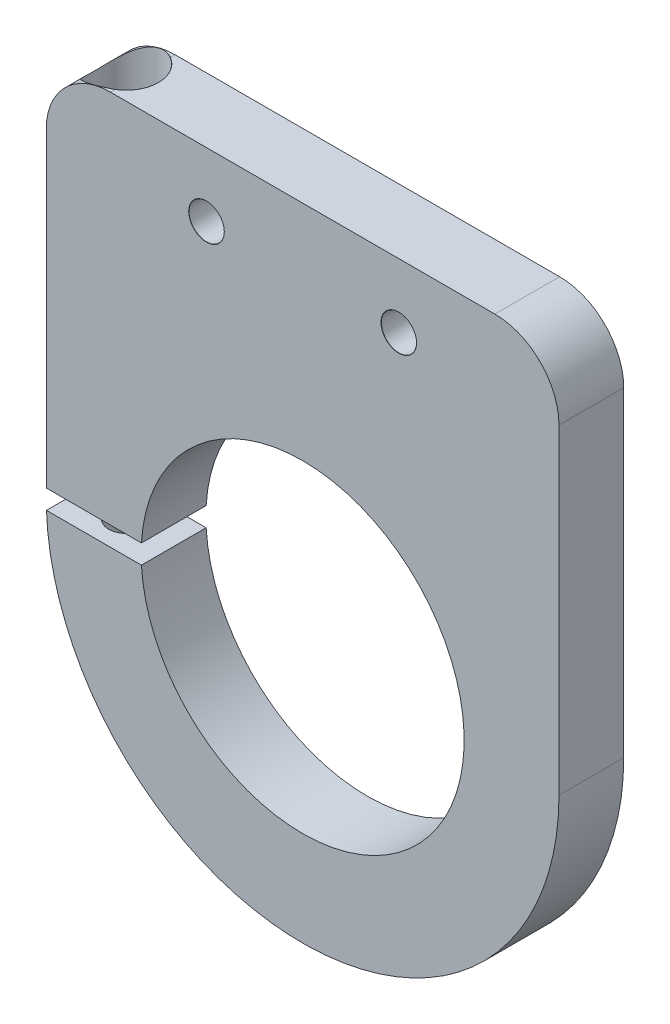
ISO-10303-21;
HEADER;
FILE_DESCRIPTION(('STEP AP214'),'2;1');
FILE_NAME('part.step','',(''),(''),'','','');
FILE_SCHEMA(('AUTOMOTIVE_DESIGN { 1 0 10303 214 1 1 1 1 }'));
ENDSEC;
DATA;
#1=APPLICATION_CONTEXT('core data for automotive mechanical design processes');
#2=APPLICATION_PROTOCOL_DEFINITION('international standard','automotive_design',2000,#1);
#3=PRODUCT_CONTEXT('',#1,'mechanical');
#4=PRODUCT('Part','Part','',(#3));
#5=PRODUCT_RELATED_PRODUCT_CATEGORY('part','',(#4));
#6=PRODUCT_DEFINITION_FORMATION('','',#4);
#7=PRODUCT_DEFINITION_CONTEXT('part definition',#1,'design');
#8=PRODUCT_DEFINITION('design','',#6,#7);
#9=PRODUCT_DEFINITION_SHAPE('','',#8);
#10=(LENGTH_UNIT() NAMED_UNIT(*) SI_UNIT(.MILLI.,.METRE.));
#11=(NAMED_UNIT(*) PLANE_ANGLE_UNIT() SI_UNIT($,.RADIAN.));
#12=(NAMED_UNIT(*) SI_UNIT($,.STERADIAN.) SOLID_ANGLE_UNIT());
#13=UNCERTAINTY_MEASURE_WITH_UNIT(LENGTH_MEASURE(1.E-05),#10,'distance_accuracy_value','');
#14=(GEOMETRIC_REPRESENTATION_CONTEXT(3) GLOBAL_UNCERTAINTY_ASSIGNED_CONTEXT((#13)) GLOBAL_UNIT_ASSIGNED_CONTEXT((#10,
#11,#12)) REPRESENTATION_CONTEXT('',''));
#15=CARTESIAN_POINT('',(0.,0.,0.));
#16=DIRECTION('',(0.,0.,1.));
#17=DIRECTION('',(1.,0.,0.));
#18=AXIS2_PLACEMENT_3D('',#15,#16,#17);
#19=CARTESIAN_POINT('',(-40.,0.,10.1));
#20=DIRECTION('',(-1.,0.,0.));
#21=DIRECTION('',(0.,0.,1.));
#22=AXIS2_PLACEMENT_3D('',#19,#20,#21);
#23=PLANE('',#22);
#24=DIRECTION('',(0.,1.,0.));
#25=VECTOR('',#24,1.);
#26=CARTESIAN_POINT('',(-40.,0.,10.1));
#27=LINE('',#26,#25);
#28=CARTESIAN_POINT('',(-40.,1.5,10.1));
#29=VERTEX_POINT('',#28);
#30=CARTESIAN_POINT('',(-40.,50.,10.1));
#31=VERTEX_POINT('',#30);
#32=EDGE_CURVE('E262',#29,#31,#27,.T.);
#33=ORIENTED_EDGE('',*,*,#32,.T.);
#34=DIRECTION('',(0.,0.,-1.));
#35=VECTOR('',#34,1.);
#36=CARTESIAN_POINT('',(-40.,50.,10.1));
#37=LINE('',#36,#35);
#38=CARTESIAN_POINT('',(-40.,50.,0.));
#39=VERTEX_POINT('',#38);
#40=EDGE_CURVE('E292',#31,#39,#37,.T.);
#41=ORIENTED_EDGE('',*,*,#40,.T.);
#42=DIRECTION('',(0.,1.,0.));
#43=VECTOR('',#42,1.);
#44=CARTESIAN_POINT('',(-40.,0.,0.));
#45=LINE('',#44,#43);
#46=CARTESIAN_POINT('',(-40.,1.5,0.));
#47=VERTEX_POINT('',#46);
#48=EDGE_CURVE('E277',#47,#39,#45,.T.);
#49=ORIENTED_EDGE('',*,*,#48,.F.);
#50=DIRECTION('',(0.,0.,1.));
#51=VECTOR('',#50,1.);
#52=CARTESIAN_POINT('',(-40.,1.5,0.));
#53=LINE('',#52,#51);
#54=EDGE_CURVE('E248',#47,#29,#53,.T.);
#55=ORIENTED_EDGE('',*,*,#54,.T.);
#56=EDGE_LOOP('',(#33,#41,#49,#55));
#57=FACE_BOUND('',#56,.T.);
#58=ADVANCED_FACE('F41',(#57),#23,.T.);
#59=CARTESIAN_POINT('',(0.,0.,10.1));
#60=DIRECTION('',(0.,0.,-1.));
#61=DIRECTION('',(-1.,0.,0.));
#62=AXIS2_PLACEMENT_3D('',#59,#60,#61);
#63=CYLINDRICAL_SURFACE('',#62,40.);
#64=CARTESIAN_POINT('',(0.,0.,53.251794638514));
#65=DIRECTION('',(0.866025403784438,0.,-0.5));
#66=DIRECTION('',(-0.5,0.,-0.866025403784439));
#67=AXIS2_PLACEMENT_3D('',#64,#65,#66);
#68=ELLIPSE('',#67,80.,40.);
#69=CARTESIAN_POINT('',(-27.8293191099691,-28.7320204280087,5.05));
#70=VERTEX_POINT('',#69);
#71=CARTESIAN_POINT('',(-30.1964552136466,-26.233072495044,0.95));
#72=VERTEX_POINT('',#71);
#73=EDGE_CURVE('E49',#70,#72,#68,.T.);
#74=ORIENTED_EDGE('',*,*,#73,.T.);
#75=CARTESIAN_POINT('',(0.,0.,0.949999999999996));
#76=DIRECTION('',(0.,0.,-1.));
#77=DIRECTION('',(-1.,0.,0.));
#78=AXIS2_PLACEMENT_3D('',#75,#76,#77);
#79=CIRCLE('',#78,40.);
#80=CARTESIAN_POINT('',(-34.9307274210015,-19.4895941938177,0.950000000000002));
#81=VERTEX_POINT('',#80);
#82=EDGE_CURVE('E11',#72,#81,#79,.T.);
#83=ORIENTED_EDGE('',*,*,#82,.T.);
#84=CARTESIAN_POINT('',(0.,0.,-59.5517946385141));
#85=DIRECTION('',(-0.866025403784439,0.,-0.5));
#86=DIRECTION('',(0.5,0.,-0.866025403784439));
#87=AXIS2_PLACEMENT_3D('',#84,#85,#86);
#88=ELLIPSE('',#87,80.0000000000001,40.);
#89=CARTESIAN_POINT('',(-36.4383040220041,-16.5,3.56119926923845));
#90=VERTEX_POINT('',#89);
#91=EDGE_CURVE('E349',#81,#90,#88,.T.);
#92=ORIENTED_EDGE('',*,*,#91,.T.);
#93=DIRECTION('',(0.,0.,-1.));
#94=VECTOR('',#93,1.);
#95=CARTESIAN_POINT('',(-36.4383040220041,-16.5,10.1));
#96=LINE('',#95,#94);
#97=CARTESIAN_POINT('',(-36.4383040220041,-16.5,6.53880073076155));
#98=VERTEX_POINT('',#97);
#99=EDGE_CURVE('E201',#90,#98,#96,.F.);
#100=ORIENTED_EDGE('',*,*,#99,.T.);
#101=CARTESIAN_POINT('',(0.,0.,69.651794638514));
#102=DIRECTION('',(-0.866025403784439,0.,0.5));
#103=DIRECTION('',(-0.5,0.,-0.866025403784439));
#104=AXIS2_PLACEMENT_3D('',#101,#102,#103);
#105=ELLIPSE('',#104,80.,40.);
#106=CARTESIAN_POINT('',(-34.9307274210015,-19.4895941938177,9.14999999999999));
#107=VERTEX_POINT('',#106);
#108=EDGE_CURVE('E354',#98,#107,#105,.T.);
#109=ORIENTED_EDGE('',*,*,#108,.T.);
#110=CARTESIAN_POINT('',(0.,0.,9.14999999999999));
#111=DIRECTION('',(0.,0.,1.));
#112=DIRECTION('',(1.,0.,0.));
#113=AXIS2_PLACEMENT_3D('',#110,#111,#112);
#114=CIRCLE('',#113,40.);
#115=CARTESIAN_POINT('',(-30.1964552136466,-26.233072495044,9.14999999999999));
#116=VERTEX_POINT('',#115);
#117=EDGE_CURVE('E357',#107,#116,#114,.T.);
#118=ORIENTED_EDGE('',*,*,#117,.T.);
#119=CARTESIAN_POINT('',(0.,0.,-43.1517946385141));
#120=DIRECTION('',(0.866025403784439,0.,0.499999999999999));
#121=DIRECTION('',(0.5,0.,-0.866025403784439));
#122=AXIS2_PLACEMENT_3D('',#119,#120,#121);
#123=ELLIPSE('',#122,80.0000000000001,40.);
#124=EDGE_CURVE('E360',#116,#70,#123,.T.);
#125=ORIENTED_EDGE('',*,*,#124,.T.);
#126=EDGE_LOOP('',(#74,#83,#92,#100,#109,#118,#125));
#127=FACE_BOUND('',#126,.T.);
#128=CARTESIAN_POINT('',(0.,0.,10.1));
#129=DIRECTION('',(0.,0.,1.));
#130=DIRECTION('',(1.,0.,0.));
#131=AXIS2_PLACEMENT_3D('',#128,#129,#130);
#132=CIRCLE('',#131,40.);
#133=CARTESIAN_POINT('',(-39.9718651053463,-1.5,10.1));
#134=VERTEX_POINT('',#133);
#135=CARTESIAN_POINT('',(40.,0.,10.1));
#136=VERTEX_POINT('',#135);
#137=EDGE_CURVE('E266',#134,#136,#132,.T.);
#138=ORIENTED_EDGE('',*,*,#137,.F.);
#139=DIRECTION('',(0.,0.,-1.));
#140=VECTOR('',#139,1.);
#141=CARTESIAN_POINT('',(-39.9718651053463,-1.5,10.1));
#142=LINE('',#141,#140);
#143=CARTESIAN_POINT('',(-39.9718651053463,-1.5,0.));
#144=VERTEX_POINT('',#143);
#145=EDGE_CURVE('E251',#134,#144,#142,.T.);
#146=ORIENTED_EDGE('',*,*,#145,.T.);
#147=CARTESIAN_POINT('',(0.,0.,0.));
#148=DIRECTION('',(0.,0.,1.));
#149=DIRECTION('',(1.,0.,0.));
#150=AXIS2_PLACEMENT_3D('',#147,#148,#149);
#151=CIRCLE('',#150,40.);
#152=CARTESIAN_POINT('',(40.,0.,0.));
#153=VERTEX_POINT('',#152);
#154=EDGE_CURVE('E280',#144,#153,#151,.T.);
#155=ORIENTED_EDGE('',*,*,#154,.T.);
#156=DIRECTION('',(0.,0.,-1.));
#157=VECTOR('',#156,1.);
#158=CARTESIAN_POINT('',(40.,0.,10.1));
#159=LINE('',#158,#157);
#160=EDGE_CURVE('E274',#136,#153,#159,.T.);
#161=ORIENTED_EDGE('',*,*,#160,.F.);
#162=EDGE_LOOP('',(#138,#146,#155,#161));
#163=FACE_BOUND('',#162,.T.);
#164=ADVANCED_FACE('F362',(#127,#163),#63,.T.);
#165=CARTESIAN_POINT('',(40.,0.,10.1));
#166=DIRECTION('',(1.,0.,0.));
#167=DIRECTION('',(0.,0.,-1.));
#168=AXIS2_PLACEMENT_3D('',#165,#166,#167);
#169=PLANE('',#168);
#170=DIRECTION('',(0.,-1.,0.));
#171=VECTOR('',#170,1.);
#172=CARTESIAN_POINT('',(40.,0.,0.));
#173=LINE('',#172,#171);
#174=CARTESIAN_POINT('',(40.,50.,0.));
#175=VERTEX_POINT('',#174);
#176=EDGE_CURVE('E283',#175,#153,#173,.T.);
#177=ORIENTED_EDGE('',*,*,#176,.F.);
#178=DIRECTION('',(0.,0.,-1.));
#179=VECTOR('',#178,1.);
#180=CARTESIAN_POINT('',(40.,50.,10.1));
#181=LINE('',#180,#179);
#182=CARTESIAN_POINT('',(40.,50.,10.1));
#183=VERTEX_POINT('',#182);
#184=EDGE_CURVE('E64',#175,#183,#181,.F.);
#185=ORIENTED_EDGE('',*,*,#184,.T.);
#186=DIRECTION('',(0.,-1.,0.));
#187=VECTOR('',#186,1.);
#188=CARTESIAN_POINT('',(40.,0.,10.1));
#189=LINE('',#188,#187);
#190=EDGE_CURVE('E269',#183,#136,#189,.T.);
#191=ORIENTED_EDGE('',*,*,#190,.T.);
#192=ORIENTED_EDGE('',*,*,#160,.T.);
#193=EDGE_LOOP('',(#177,#185,#191,#192));
#194=FACE_BOUND('',#193,.T.);
#195=ADVANCED_FACE('F390',(#194),#169,.T.);
#196=CARTESIAN_POINT('',(0.,0.,10.1));
#197=DIRECTION('',(0.,0.,-1.));
#198=DIRECTION('',(-1.,0.,0.));
#199=AXIS2_PLACEMENT_3D('',#196,#197,#198);
#200=CYLINDRICAL_SURFACE('',#199,25.2);
#201=DIRECTION('',(0.,0.,1.));
#202=VECTOR('',#201,1.);
#203=CARTESIAN_POINT('',(-25.1553175293018,1.5,0.));
#204=LINE('',#203,#202);
#205=CARTESIAN_POINT('',(-25.1553175293018,1.5,0.));
#206=VERTEX_POINT('',#205);
#207=CARTESIAN_POINT('',(-25.1553175293018,1.5,10.1));
#208=VERTEX_POINT('',#207);
#209=EDGE_CURVE('E252',#206,#208,#204,.T.);
#210=ORIENTED_EDGE('',*,*,#209,.F.);
#211=CARTESIAN_POINT('',(0.,0.,0.));
#212=DIRECTION('',(0.,0.,1.));
#213=DIRECTION('',(1.,0.,0.));
#214=AXIS2_PLACEMENT_3D('',#211,#212,#213);
#215=CIRCLE('',#214,25.2);
#216=CARTESIAN_POINT('',(-25.1553175293018,-1.5,0.));
#217=VERTEX_POINT('',#216);
#218=EDGE_CURVE('E258',#217,#206,#215,.T.);
#219=ORIENTED_EDGE('',*,*,#218,.F.);
#220=DIRECTION('',(0.,0.,1.));
#221=VECTOR('',#220,1.);
#222=CARTESIAN_POINT('',(-25.1553175293018,-1.5,0.));
#223=LINE('',#222,#221);
#224=CARTESIAN_POINT('',(-25.1553175293018,-1.5,10.1));
#225=VERTEX_POINT('',#224);
#226=EDGE_CURVE('E244',#217,#225,#223,.T.);
#227=ORIENTED_EDGE('',*,*,#226,.T.);
#228=CARTESIAN_POINT('',(0.,0.,10.1));
#229=DIRECTION('',(0.,0.,1.));
#230=DIRECTION('',(1.,0.,0.));
#231=AXIS2_PLACEMENT_3D('',#228,#229,#230);
#232=CIRCLE('',#231,25.2);
#233=EDGE_CURVE('E259',#225,#208,#232,.T.);
#234=ORIENTED_EDGE('',*,*,#233,.T.);
#235=EDGE_LOOP('',(#210,#219,#227,#234));
#236=FACE_BOUND('',#235,.T.);
#237=ADVANCED_FACE('F393',(#236),#200,.F.);
#238=CARTESIAN_POINT('',(0.,60.,10.1));
#239=DIRECTION('',(0.,1.,0.));
#240=DIRECTION('',(0.,0.,1.));
#241=AXIS2_PLACEMENT_3D('',#238,#239,#240);
#242=PLANE('',#241);
#243=DIRECTION('',(1.,0.,0.));
#244=VECTOR('',#243,1.);
#245=CARTESIAN_POINT('',(0.,60.,0.));
#246=LINE('',#245,#244);
#247=CARTESIAN_POINT('',(-30.,60.,0.));
#248=VERTEX_POINT('',#247);
#249=CARTESIAN_POINT('',(30.,60.,0.));
#250=VERTEX_POINT('',#249);
#251=EDGE_CURVE('E263',#248,#250,#246,.T.);
#252=ORIENTED_EDGE('',*,*,#251,.F.);
#253=DIRECTION('',(0.,0.,-1.));
#254=VECTOR('',#253,1.);
#255=CARTESIAN_POINT('',(-30.,60.,10.1));
#256=LINE('',#255,#254);
#257=CARTESIAN_POINT('',(-30.,60.,0.728122565627212));
#258=VERTEX_POINT('',#257);
#259=EDGE_CURVE('E304',#248,#258,#256,.F.);
#260=ORIENTED_EDGE('',*,*,#259,.T.);
#261=CARTESIAN_POINT('',(-32.5635913173241,60.,5.05));
#262=DIRECTION('',(0.,1.,0.));
#263=DIRECTION('',(0.,0.,1.));
#264=AXIS2_PLACEMENT_3D('',#261,#262,#263);
#265=CIRCLE('',#264,5.025);
#266=CARTESIAN_POINT('',(-30.,60.,9.37187743437279));
#267=VERTEX_POINT('',#266);
#268=EDGE_CURVE('E222',#267,#258,#265,.T.);
#269=ORIENTED_EDGE('',*,*,#268,.F.);
#270=DIRECTION('',(0.,0.,-1.));
#271=VECTOR('',#270,1.);
#272=CARTESIAN_POINT('',(-30.,60.,10.1));
#273=LINE('',#272,#271);
#274=CARTESIAN_POINT('',(-30.,60.,10.1));
#275=VERTEX_POINT('',#274);
#276=EDGE_CURVE('E302',#267,#275,#273,.F.);
#277=ORIENTED_EDGE('',*,*,#276,.T.);
#278=DIRECTION('',(1.,0.,0.));
#279=VECTOR('',#278,1.);
#280=CARTESIAN_POINT('',(0.,60.,10.1));
#281=LINE('',#280,#279);
#282=CARTESIAN_POINT('',(30.,60.,10.1));
#283=VERTEX_POINT('',#282);
#284=EDGE_CURVE('E271',#275,#283,#281,.T.);
#285=ORIENTED_EDGE('',*,*,#284,.T.);
#286=DIRECTION('',(0.,0.,-1.));
#287=VECTOR('',#286,1.);
#288=CARTESIAN_POINT('',(30.,60.,10.1));
#289=LINE('',#288,#287);
#290=EDGE_CURVE('E299',#283,#250,#289,.T.);
#291=ORIENTED_EDGE('',*,*,#290,.T.);
#292=EDGE_LOOP('',(#252,#260,#269,#277,#285,#291));
#293=FACE_BOUND('',#292,.T.);
#294=ADVANCED_FACE('F395',(#293),#242,.T.);
#295=CARTESIAN_POINT('',(0.,0.,10.1));
#296=DIRECTION('',(0.,0.,1.));
#297=DIRECTION('',(1.,0.,0.));
#298=AXIS2_PLACEMENT_3D('',#295,#296,#297);
#299=PLANE('',#298);
#300=CARTESIAN_POINT('',(-15.,50.,10.1));
#301=DIRECTION('',(0.,0.,1.));
#302=DIRECTION('',(1.,0.,0.));
#303=AXIS2_PLACEMENT_3D('',#300,#301,#302);
#304=CIRCLE('',#303,2.775);
#305=CARTESIAN_POINT('',(-12.225,50.,10.1));
#306=VERTEX_POINT('',#305);
#307=EDGE_CURVE('E204',#306,#306,#304,.T.);
#308=ORIENTED_EDGE('',*,*,#307,.F.);
#309=EDGE_LOOP('',(#308));
#310=FACE_BOUND('',#309,.T.);
#311=CARTESIAN_POINT('',(15.,50.,10.1));
#312=DIRECTION('',(0.,0.,1.));
#313=DIRECTION('',(1.,0.,0.));
#314=AXIS2_PLACEMENT_3D('',#311,#312,#313);
#315=CIRCLE('',#314,2.775);
#316=CARTESIAN_POINT('',(17.775,50.,10.1));
#317=VERTEX_POINT('',#316);
#318=EDGE_CURVE('E213',#317,#317,#315,.T.);
#319=ORIENTED_EDGE('',*,*,#318,.F.);
#320=EDGE_LOOP('',(#319));
#321=FACE_BOUND('',#320,.T.);
#322=ORIENTED_EDGE('',*,*,#284,.F.);
#323=CARTESIAN_POINT('',(-30.,50.,10.1));
#324=DIRECTION('',(0.,0.,1.));
#325=DIRECTION('',(1.,0.,0.));
#326=AXIS2_PLACEMENT_3D('',#323,#324,#325);
#327=CIRCLE('',#326,10.);
#328=EDGE_CURVE('E346',#275,#31,#327,.T.);
#329=ORIENTED_EDGE('',*,*,#328,.T.);
#330=ORIENTED_EDGE('',*,*,#32,.F.);
#331=DIRECTION('',(-1.,0.,0.));
#332=VECTOR('',#331,1.);
#333=CARTESIAN_POINT('',(-40.,1.5,10.1));
#334=LINE('',#333,#332);
#335=EDGE_CURVE('E245',#208,#29,#334,.T.);
#336=ORIENTED_EDGE('',*,*,#335,.F.);
#337=ORIENTED_EDGE('',*,*,#233,.F.);
#338=DIRECTION('',(1.,0.,0.));
#339=VECTOR('',#338,1.);
#340=CARTESIAN_POINT('',(-40.,-1.5,10.1));
#341=LINE('',#340,#339);
#342=EDGE_CURVE('E240',#134,#225,#341,.T.);
#343=ORIENTED_EDGE('',*,*,#342,.F.);
#344=ORIENTED_EDGE('',*,*,#137,.T.);
#345=ORIENTED_EDGE('',*,*,#190,.F.);
#346=CARTESIAN_POINT('',(30.,50.,10.1));
#347=DIRECTION('',(0.,0.,1.));
#348=DIRECTION('',(1.,0.,0.));
#349=AXIS2_PLACEMENT_3D('',#346,#347,#348);
#350=CIRCLE('',#349,10.);
#351=EDGE_CURVE('E344',#183,#283,#350,.T.);
#352=ORIENTED_EDGE('',*,*,#351,.T.);
#353=EDGE_LOOP('',(#322,#329,#330,#336,#337,#343,#344,#345,#352));
#354=FACE_BOUND('',#353,.T.);
#355=ADVANCED_FACE('F401',(#310,#321,#354),#299,.T.);
#356=CARTESIAN_POINT('',(0.,0.,0.));
#357=DIRECTION('',(0.,0.,1.));
#358=DIRECTION('',(1.,0.,0.));
#359=AXIS2_PLACEMENT_3D('',#356,#357,#358);
#360=PLANE('',#359);
#361=CARTESIAN_POINT('',(-15.,50.,0.));
#362=DIRECTION('',(0.,0.,1.));
#363=DIRECTION('',(1.,0.,0.));
#364=AXIS2_PLACEMENT_3D('',#361,#362,#363);
#365=CIRCLE('',#364,2.75);
#366=CARTESIAN_POINT('',(-12.25,50.,0.));
#367=VERTEX_POINT('',#366);
#368=EDGE_CURVE('E210',#367,#367,#365,.T.);
#369=ORIENTED_EDGE('',*,*,#368,.T.);
#370=EDGE_LOOP('',(#369));
#371=FACE_BOUND('',#370,.T.);
#372=CARTESIAN_POINT('',(15.,50.,0.));
#373=DIRECTION('',(0.,0.,1.));
#374=DIRECTION('',(1.,0.,0.));
#375=AXIS2_PLACEMENT_3D('',#372,#373,#374);
#376=CIRCLE('',#375,2.75);
#377=CARTESIAN_POINT('',(17.75,50.,0.));
#378=VERTEX_POINT('',#377);
#379=EDGE_CURVE('E219',#378,#378,#376,.T.);
#380=ORIENTED_EDGE('',*,*,#379,.T.);
#381=EDGE_LOOP('',(#380));
#382=FACE_BOUND('',#381,.T.);
#383=ORIENTED_EDGE('',*,*,#48,.T.);
#384=CARTESIAN_POINT('',(-30.,50.,0.));
#385=DIRECTION('',(0.,0.,1.));
#386=DIRECTION('',(1.,0.,0.));
#387=AXIS2_PLACEMENT_3D('',#384,#385,#386);
#388=CIRCLE('',#387,10.);
#389=EDGE_CURVE('E297',#39,#248,#388,.F.);
#390=ORIENTED_EDGE('',*,*,#389,.T.);
#391=ORIENTED_EDGE('',*,*,#251,.T.);
#392=CARTESIAN_POINT('',(30.,50.,0.));
#393=DIRECTION('',(0.,0.,1.));
#394=DIRECTION('',(1.,0.,0.));
#395=AXIS2_PLACEMENT_3D('',#392,#393,#394);
#396=CIRCLE('',#395,10.);
#397=EDGE_CURVE('E295',#250,#175,#396,.F.);
#398=ORIENTED_EDGE('',*,*,#397,.T.);
#399=ORIENTED_EDGE('',*,*,#176,.T.);
#400=ORIENTED_EDGE('',*,*,#154,.F.);
#401=DIRECTION('',(1.,0.,0.));
#402=VECTOR('',#401,1.);
#403=CARTESIAN_POINT('',(0.,-1.5,0.));
#404=LINE('',#403,#402);
#405=EDGE_CURVE('E289',#144,#217,#404,.T.);
#406=ORIENTED_EDGE('',*,*,#405,.T.);
#407=ORIENTED_EDGE('',*,*,#218,.T.);
#408=DIRECTION('',(-1.,0.,0.));
#409=VECTOR('',#408,1.);
#410=CARTESIAN_POINT('',(-40.,1.5,0.));
#411=LINE('',#410,#409);
#412=EDGE_CURVE('E241',#206,#47,#411,.T.);
#413=ORIENTED_EDGE('',*,*,#412,.T.);
#414=EDGE_LOOP('',(#383,#390,#391,#398,#399,#400,#406,#407,#413));
#415=FACE_BOUND('',#414,.T.);
#416=ADVANCED_FACE('F410',(#371,#382,#415),#360,.F.);
#417=CARTESIAN_POINT('',(-40.,-1.5,0.));
#418=DIRECTION('',(0.,-1.,0.));
#419=DIRECTION('',(1.,0.,0.));
#420=AXIS2_PLACEMENT_3D('',#417,#418,#419);
#421=PLANE('',#420);
#422=CARTESIAN_POINT('',(-32.5635913173241,-1.5,5.05));
#423=DIRECTION('',(0.,-1.,0.));
#424=DIRECTION('',(1.,0.,0.));
#425=AXIS2_PLACEMENT_3D('',#422,#423,#424);
#426=CIRCLE('',#425,2.74999999999999);
#427=CARTESIAN_POINT('',(-29.8135913173241,-1.5,5.05));
#428=VERTEX_POINT('',#427);
#429=EDGE_CURVE('E237',#428,#428,#426,.T.);
#430=ORIENTED_EDGE('',*,*,#429,.T.);
#431=EDGE_LOOP('',(#430));
#432=FACE_BOUND('',#431,.T.);
#433=ORIENTED_EDGE('',*,*,#342,.T.);
#434=ORIENTED_EDGE('',*,*,#226,.F.);
#435=ORIENTED_EDGE('',*,*,#405,.F.);
#436=ORIENTED_EDGE('',*,*,#145,.F.);
#437=EDGE_LOOP('',(#433,#434,#435,#436));
#438=FACE_BOUND('',#437,.T.);
#439=ADVANCED_FACE('F414',(#432,#438),#421,.F.);
#440=CARTESIAN_POINT('',(-40.,1.5,0.));
#441=DIRECTION('',(0.,1.,0.));
#442=DIRECTION('',(-1.,0.,0.));
#443=AXIS2_PLACEMENT_3D('',#440,#441,#442);
#444=PLANE('',#443);
#445=CARTESIAN_POINT('',(-32.5635913173241,1.5,5.05));
#446=DIRECTION('',(0.,1.,0.));
#447=DIRECTION('',(-1.,0.,0.));
#448=AXIS2_PLACEMENT_3D('',#445,#446,#447);
#449=CIRCLE('',#448,2.74999999999999);
#450=CARTESIAN_POINT('',(-35.313591317324,1.5,5.05));
#451=VERTEX_POINT('',#450);
#452=EDGE_CURVE('E234',#451,#451,#449,.T.);
#453=ORIENTED_EDGE('',*,*,#452,.T.);
#454=EDGE_LOOP('',(#453));
#455=FACE_BOUND('',#454,.T.);
#456=ORIENTED_EDGE('',*,*,#335,.T.);
#457=ORIENTED_EDGE('',*,*,#54,.F.);
#458=ORIENTED_EDGE('',*,*,#412,.F.);
#459=ORIENTED_EDGE('',*,*,#209,.T.);
#460=EDGE_LOOP('',(#456,#457,#458,#459));
#461=FACE_BOUND('',#460,.T.);
#462=ADVANCED_FACE('F422',(#455,#461),#444,.F.);
#463=CARTESIAN_POINT('',(-32.5635913173241,60.,5.05));
#464=DIRECTION('',(0.,1.,0.));
#465=DIRECTION('',(0.,0.,1.));
#466=AXIS2_PLACEMENT_3D('',#463,#464,#465);
#467=CYLINDRICAL_SURFACE('',#466,2.74999999999999);
#468=CARTESIAN_POINT('',(-32.5635913173241,-16.5,5.05));
#469=DIRECTION('',(0.,1.,0.));
#470=DIRECTION('',(0.,0.,1.));
#471=AXIS2_PLACEMENT_3D('',#468,#469,#470);
#472=CIRCLE('',#471,2.74999999999999);
#473=CARTESIAN_POINT('',(-32.5635913173241,-16.5,7.79999999999999));
#474=VERTEX_POINT('',#473);
#475=EDGE_CURVE('E195',#474,#474,#472,.F.);
#476=ORIENTED_EDGE('',*,*,#475,.T.);
#477=EDGE_LOOP('',(#476));
#478=FACE_BOUND('',#477,.T.);
#479=ORIENTED_EDGE('',*,*,#429,.F.);
#480=EDGE_LOOP('',(#479));
#481=FACE_BOUND('',#480,.T.);
#482=ADVANCED_FACE('F480',(#478,#481),#467,.F.);
#483=CARTESIAN_POINT('',(-32.5635913173241,50.,5.05));
#484=DIRECTION('',(0.,1.,0.));
#485=DIRECTION('',(0.,0.,1.));
#486=AXIS2_PLACEMENT_3D('',#483,#484,#485);
#487=CIRCLE('',#486,2.75);
#488=CARTESIAN_POINT('',(-32.5635913173241,50.,7.8));
#489=VERTEX_POINT('',#488);
#490=EDGE_CURVE('E231',#489,#489,#487,.T.);
#491=ORIENTED_EDGE('',*,*,#490,.T.);
#492=EDGE_LOOP('',(#491));
#493=FACE_BOUND('',#492,.T.);
#494=ORIENTED_EDGE('',*,*,#452,.F.);
#495=EDGE_LOOP('',(#494));
#496=FACE_BOUND('',#495,.T.);
#497=ADVANCED_FACE('F483',(#493,#496),#467,.F.);
#498=CARTESIAN_POINT('',(-27.5635913173241,50.,5.05));
#499=DIRECTION('',(0.,-1.,0.));
#500=DIRECTION('',(0.,0.,-1.));
#501=AXIS2_PLACEMENT_3D('',#498,#499,#500);
#502=PLANE('',#501);
#503=ORIENTED_EDGE('',*,*,#490,.F.);
#504=EDGE_LOOP('',(#503));
#505=FACE_BOUND('',#504,.T.);
#506=CARTESIAN_POINT('',(-32.5635913173241,50.,5.05));
#507=DIRECTION('',(0.,1.,0.));
#508=DIRECTION('',(0.,0.,1.));
#509=AXIS2_PLACEMENT_3D('',#506,#507,#508);
#510=CIRCLE('',#509,5.);
#511=CARTESIAN_POINT('',(-32.5635913173241,50.,10.05));
#512=VERTEX_POINT('',#511);
#513=EDGE_CURVE('E228',#512,#512,#510,.T.);
#514=ORIENTED_EDGE('',*,*,#513,.T.);
#515=EDGE_LOOP('',(#514));
#516=FACE_BOUND('',#515,.T.);
#517=ADVANCED_FACE('F335',(#505,#516),#502,.F.);
#518=CARTESIAN_POINT('',(-32.5635913173241,60.,5.05));
#519=DIRECTION('',(0.,1.,0.));
#520=DIRECTION('',(0.,0.,1.));
#521=AXIS2_PLACEMENT_3D('',#518,#519,#520);
#522=CYLINDRICAL_SURFACE('',#521,5.);
#523=ORIENTED_EDGE('',*,*,#513,.F.);
#524=EDGE_LOOP('',(#523));
#525=FACE_BOUND('',#524,.T.);
#526=CARTESIAN_POINT('',(-32.5635913173241,59.975,5.05));
#527=DIRECTION('',(0.,1.,0.));
#528=DIRECTION('',(0.,0.,1.));
#529=AXIS2_PLACEMENT_3D('',#526,#527,#528);
#530=CIRCLE('',#529,4.99999999999999);
#531=CARTESIAN_POINT('',(-30.7066647012552,59.975,9.69239416061743));
#532=VERTEX_POINT('',#531);
#533=CARTESIAN_POINT('',(-30.7066647012552,59.975,0.407605839382568));
#534=VERTEX_POINT('',#533);
#535=EDGE_CURVE('E225',#532,#534,#530,.T.);
#536=ORIENTED_EDGE('',*,*,#535,.T.);
#537=CARTESIAN_POINT('',(-30.7066647012563,59.9749999999999,0.407605839382118));
#538=CARTESIAN_POINT('',(-30.827860355132,59.966435416529,0.35910346129362));
#539=CARTESIAN_POINT('',(-30.9508262926674,59.9554838115774,0.315447707163212));
#540=CARTESIAN_POINT('',(-31.1992661123685,59.9286078876016,0.237985695919973));
#541=CARTESIAN_POINT('',(-31.3247395311649,59.912684479531,0.204177636664663));
#542=CARTESIAN_POINT('',(-31.5766643127462,59.8757428401059,0.146673224169126));
#543=CARTESIAN_POINT('',(-31.7031091552752,59.8547467984339,0.12293403913425));
#544=CARTESIAN_POINT('',(-31.9564981459066,59.8075845587991,0.0853410030436932));
#545=CARTESIAN_POINT('',(-32.0834422897745,59.7814184045905,0.0714870683345971));
#546=CARTESIAN_POINT('',(-32.3368072484082,59.724001201804,0.0535319493025308));
#547=CARTESIAN_POINT('',(-32.4632282628026,59.6927523207922,0.049426619206704));
#548=CARTESIAN_POINT('',(-32.7147458855301,59.6253372256584,0.0507023702890224));
#549=CARTESIAN_POINT('',(-32.8398419737263,59.5891691522602,0.0560870475919438));
#550=CARTESIAN_POINT('',(-33.0878963288026,59.5121899253903,0.0760089289009665));
#551=CARTESIAN_POINT('',(-33.2108539559444,59.4713774091306,0.0905488249645308));
#552=CARTESIAN_POINT('',(-33.4539149993666,59.3854742581538,0.128366805304438));
#553=CARTESIAN_POINT('',(-33.5740172885529,59.3403819680154,0.151648281210943));
#554=CARTESIAN_POINT('',(-33.9399660263189,59.1949665198824,0.236468588418862));
#555=CARTESIAN_POINT('',(-34.1800969235703,59.0880421879661,0.312039574768618));
#556=CARTESIAN_POINT('',(-34.6410676951857,58.8615275800542,0.495248379959157));
#557=CARTESIAN_POINT('',(-34.8619041566549,58.7419350714931,0.60289185714858));
#558=CARTESIAN_POINT('',(-35.315084110913,58.4752174300899,0.865717222662063));
#559=CARTESIAN_POINT('',(-35.5438279054197,58.3267111181512,1.02570045949824));
#560=CARTESIAN_POINT('',(-35.9710492119663,58.0258912765112,1.38031747200683));
#561=CARTESIAN_POINT('',(-36.1694492934071,57.8735691242394,1.57503723537818));
#562=CARTESIAN_POINT('',(-36.455080804175,57.6387246527472,1.90649903701136));
#563=CARTESIAN_POINT('',(-36.5535337558954,57.5542464134585,2.03235832298599));
#564=CARTESIAN_POINT('',(-36.7390641478581,57.3892083732819,2.29477466842778));
#565=CARTESIAN_POINT('',(-36.8261368755394,57.3086502043113,2.43133612246404));
#566=CARTESIAN_POINT('',(-36.9876838869885,57.1543493476537,2.71464344539185));
#567=CARTESIAN_POINT('',(-37.062200256085,57.0805842843429,2.8613528704779));
#568=CARTESIAN_POINT('',(-37.1976751560414,56.9428230494723,3.16508325788571));
#569=CARTESIAN_POINT('',(-37.2586482795262,56.8788163869549,3.32209288320989));
#570=CARTESIAN_POINT('',(-37.3715156057641,56.7578398130708,3.66443766915315));
#571=CARTESIAN_POINT('',(-37.4216138122869,56.7024743726605,3.85097139834873));
#572=CARTESIAN_POINT('',(-37.4806377557049,56.6363334087587,4.13774829852906));
#573=CARTESIAN_POINT('',(-37.4976219968519,56.6171081240032,4.23446766189423));
#574=CARTESIAN_POINT('',(-37.5259483738968,56.5848740498758,4.42973646415167));
#575=CARTESIAN_POINT('',(-37.5372930239706,56.571862490476,4.52828506719087));
#576=CARTESIAN_POINT('',(-37.5541669541866,56.5524598065121,4.72721655654906));
#577=CARTESIAN_POINT('',(-37.5596559002571,56.5461146042802,4.82760738083948));
#578=CARTESIAN_POINT('',(-37.5645578778696,56.5404494062543,5.02873647551352));
#579=CARTESIAN_POINT('',(-37.5639709858804,56.5411293220442,5.12947474150838));
#580=CARTESIAN_POINT('',(-37.5567317023924,56.5494913742097,5.330465443682));
#581=CARTESIAN_POINT('',(-37.5500778609833,56.5571751844114,5.43071775796768));
#582=CARTESIAN_POINT('',(-37.5308561436651,56.5792409766138,5.62992456797942));
#583=CARTESIAN_POINT('',(-37.5182858394772,56.593625708832,5.72887851366293));
#584=CARTESIAN_POINT('',(-37.4743437597331,56.643499665012,6.00819668274945));
#585=CARTESIAN_POINT('',(-37.4360749551119,56.6865319000886,6.18619206243009));
#586=CARTESIAN_POINT('',(-37.3421841475894,56.7894859775998,6.53234248882127));
#587=CARTESIAN_POINT('',(-37.2865483673496,56.8494212256513,6.70048959661351));
#588=CARTESIAN_POINT('',(-37.1721436782308,56.968919034688,6.99451392032689));
#589=CARTESIAN_POINT('',(-37.1160173363591,57.0263528948418,7.1223174190473));
#590=CARTESIAN_POINT('',(-36.9946323825294,57.1471986894131,7.3705539823409));
#591=CARTESIAN_POINT('',(-36.9293719389272,57.2106118220083,7.49098556165774));
#592=CARTESIAN_POINT('',(-36.7902683607541,57.3417580910482,7.7246445406187));
#593=CARTESIAN_POINT('',(-36.7164093102852,57.4094991304046,7.83785796056111));
#594=CARTESIAN_POINT('',(-36.5607124945411,57.5477077138456,8.05683715850867));
#595=CARTESIAN_POINT('',(-36.4788758063017,57.6181748891106,8.16260393854977));
#596=CARTESIAN_POINT('',(-36.3048585995081,57.762857140168,8.3699097435488));
#597=CARTESIAN_POINT('',(-36.212433098226,57.8371203061362,8.47120990160141));
#598=CARTESIAN_POINT('',(-36.0197623330062,57.986071374604,8.6657491839414));
#599=CARTESIAN_POINT('',(-35.9195142941564,58.0607594190317,8.75898542273569));
#600=CARTESIAN_POINT('',(-35.6073362540849,58.2838976556186,9.02625780091381));
#601=CARTESIAN_POINT('',(-35.3838670902006,58.4315115638541,9.18798285411144));
#602=CARTESIAN_POINT('',(-35.0086052907639,58.6567821263267,9.41438302025866));
#603=CARTESIAN_POINT('',(-34.866032203893,58.7378265364459,9.49132293811288));
#604=CARTESIAN_POINT('',(-34.5718800688724,58.8952620163805,9.63184778957352));
#605=CARTESIAN_POINT('',(-34.420299426755,58.9716522577261,9.6954303503932));
#606=CARTESIAN_POINT('',(-34.1092759084239,59.1182992243707,9.80795861128659));
#607=CARTESIAN_POINT('',(-33.9498461022291,59.188565639951,9.85692774457408));
#608=CARTESIAN_POINT('',(-33.6240713440829,59.3218577629078,9.9391275764273));
#609=CARTESIAN_POINT('',(-33.4577294154999,59.3848865915417,9.97236507881579));
#610=CARTESIAN_POINT('',(-33.1651028258469,59.4867954284619,10.0152599054767));
#611=CARTESIAN_POINT('',(-33.0400566869657,59.5276151240967,10.0288525662243));
#612=CARTESIAN_POINT('',(-32.7878415835199,59.6044417897517,10.0465671042298));
#613=CARTESIAN_POINT('',(-32.6606730644745,59.6404497558807,10.050690944562));
#614=CARTESIAN_POINT('',(-32.4051189653142,59.707360226469,10.0491206135022));
#615=CARTESIAN_POINT('',(-32.27673398595,59.7382651249707,10.0434310603666));
#616=CARTESIAN_POINT('',(-32.0196949181623,59.794801676646,10.0220016068011));
#617=CARTESIAN_POINT('',(-31.8910409717795,59.8204356272586,10.0062660974142));
#618=CARTESIAN_POINT('',(-31.6343407042641,59.8664047501151,9.96461196356324));
#619=CARTESIAN_POINT('',(-31.5062948591574,59.8867362845136,9.93868637837579));
#620=CARTESIAN_POINT('',(-31.251943963736,59.922153603557,9.87666771797359));
#621=CARTESIAN_POINT('',(-31.1256389985272,59.9372391326089,9.84057414751504));
#622=CARTESIAN_POINT('',(-30.8753379613286,59.9624113982528,9.75820673297558));
#623=CARTESIAN_POINT('',(-30.7513527429685,59.9724785222597,9.71189395182955));
#624=CARTESIAN_POINT('',(-30.5071884806191,59.9878840498512,9.60947328061493));
#625=CARTESIAN_POINT('',(-30.387009517169,59.9932223534398,9.55336518344402));
#626=CARTESIAN_POINT('',(-30.2692319192881,59.9963750516693,9.49251223438314));
#627=B_SPLINE_CURVE_WITH_KNOTS('',3,(#537,#538,#539,#540,#541,#542,#543,#544,#545,#546,#547,
#548,#549,#550,#551,#552,#553,#554,#555,#556,#557,#558,#559,#560,#561,#562,#563,#564,#565,#566,
#567,#568,#569,#570,#571,#572,#573,#574,#575,#576,#577,#578,#579,#580,#581,#582,#583,#584,#585,
#586,#587,#588,#589,#590,#591,#592,#593,#594,#595,#596,#597,#598,#599,#600,#601,#602,#603,#604,
#605,#606,#607,#608,#609,#610,#611,#612,#613,#614,#615,#616,#617,#618,#619,#620,#621,#622,#623,
#624,#625,#626),.UNSPECIFIED.,.F.,.F.,(4,2,2,2,2,2,2,2,2,2,2,2,2,2,2,2,2,2,2,2,2,2,2,2,2,2,2,2,
2,2,2,2,2,2,2,2,2,2,2,2,2,2,2,2,4),(0.,0.392342022700355,0.784612201066487,1.17519655351071,
1.56577760061601,1.95619251619925,2.34675540665534,2.73743319431795,3.12826271726111,
3.94533512031608,4.76255175977784,5.70754595919987,6.65491272941827,7.19656545083954,
7.73844176523206,8.27846409117939,8.81790169849444,9.41809526026173,9.71797870579153,
10.0177283406562,10.3195295771145,10.6213270151962,10.9231965972707,11.2251901830937,
11.7841332504649,12.3435208628721,12.7957334939006,13.24803693654,13.7011913116013,
14.1542845922268,14.6216813064782,15.08924458215,16.0238163574193,16.5666445922017,
17.1095691730304,17.6516184158644,18.1934330114067,18.5897491154862,18.9859830479555,
19.3820305606452,19.777905081129,20.1740504902146,20.5702151973691,20.9679162621111,
21.365625736463),.UNSPECIFIED.);
#628=EDGE_CURVE('E338',#534,#532,#627,.T.);
#629=ORIENTED_EDGE('',*,*,#628,.T.);
#630=EDGE_LOOP('',(#536,#629));
#631=FACE_BOUND('',#630,.T.);
#632=ADVANCED_FACE('F328',(#525,#631),#522,.F.);
#633=CARTESIAN_POINT('',(-32.5635913173241,60.,5.05));
#634=DIRECTION('',(0.,1.,0.));
#635=DIRECTION('',(0.,0.,1.));
#636=AXIS2_PLACEMENT_3D('',#633,#634,#635);
#637=CONICAL_SURFACE('',#636,5.025,0.785398163397518);
#638=ORIENTED_EDGE('',*,*,#268,.T.);
#639=CARTESIAN_POINT('',(-30.,60.,0.728122565627212));
#640=CARTESIAN_POINT('',(-30.0788364018077,60.0000050014083,0.68134349097746));
#641=CARTESIAN_POINT('',(-30.15946170707,59.9990675697666,0.637536433436425));
#642=CARTESIAN_POINT('',(-30.3232537969961,59.9951062420872,0.556602950160756));
#643=CARTESIAN_POINT('',(-30.4063992421382,59.9920967670245,0.519432572362842));
#644=CARTESIAN_POINT('',(-30.5753073639118,59.9837950062374,0.451847126039772));
#645=CARTESIAN_POINT('',(-30.6610704298698,59.9785023793803,0.421433068025907));
#646=CARTESIAN_POINT('',(-30.8352126094172,59.9654475333822,0.367519527784197));
#647=CARTESIAN_POINT('',(-30.923605744931,59.9576684348683,0.344069483216149));
#648=CARTESIAN_POINT('',(-31.0127180441463,59.9485879481995,0.324392190520006));
#649=B_SPLINE_CURVE_WITH_KNOTS('',3,(#639,#640,#641,#642,#643,#644,#645,#646,#647,#648),
.UNSPECIFIED.,.F.,.F.,(4,2,2,2,4),(0.,0.274973418658145,0.548052174392227,0.821171745786518,
1.09618623292706),.UNSPECIFIED.);
#650=EDGE_CURVE('E313',#258,#534,#649,.T.);
#651=ORIENTED_EDGE('',*,*,#650,.T.);
#652=ORIENTED_EDGE('',*,*,#535,.F.);
#653=CARTESIAN_POINT('',(-30.7066647012552,59.975,9.69239416061743));
#654=CARTESIAN_POINT('',(-30.6118635876635,59.9817254537022,9.66173174493452));
#655=CARTESIAN_POINT('',(-30.5183776560108,59.9869808575484,9.6267919919315));
#656=CARTESIAN_POINT('',(-30.3353519044135,59.9947895104791,9.5492212627474));
#657=CARTESIAN_POINT('',(-30.2457879095719,59.9973625630464,9.50664941313245));
#658=CARTESIAN_POINT('',(-30.0705088488402,60.0001361894604,9.41421269131845));
#659=CARTESIAN_POINT('',(-29.9847931030153,60.0003371840749,9.36434911415228));
#660=CARTESIAN_POINT('',(-29.8169911934805,59.9986805696884,9.2575574347057));
#661=CARTESIAN_POINT('',(-29.7349370351798,59.996807525781,9.20057920211365));
#662=CARTESIAN_POINT('',(-29.6552595154549,59.9940559333193,9.14054135684072));
#663=B_SPLINE_CURVE_WITH_KNOTS('',3,(#653,#654,#655,#656,#657,#658,#659,#660,#661,#662),
.UNSPECIFIED.,.F.,.F.,(4,2,2,2,4),(0.,0.299431181601102,0.596635695620824,0.893787489183162,
1.19316562560422),.UNSPECIFIED.);
#664=EDGE_CURVE('E306',#532,#267,#663,.T.);
#665=ORIENTED_EDGE('',*,*,#664,.T.);
#666=EDGE_LOOP('',(#638,#651,#652,#665));
#667=FACE_BOUND('',#666,.T.);
#668=ADVANCED_FACE('F322',(#667),#637,.F.);
#669=CARTESIAN_POINT('',(15.,50.,10.1));
#670=DIRECTION('',(0.,0.,1.));
#671=DIRECTION('',(1.,0.,0.));
#672=AXIS2_PLACEMENT_3D('',#669,#670,#671);
#673=CYLINDRICAL_SURFACE('',#672,2.75);
#674=ORIENTED_EDGE('',*,*,#379,.F.);
#675=EDGE_LOOP('',(#674));
#676=FACE_BOUND('',#675,.T.);
#677=CARTESIAN_POINT('',(15.,50.,10.075));
#678=DIRECTION('',(0.,0.,1.));
#679=DIRECTION('',(1.,0.,0.));
#680=AXIS2_PLACEMENT_3D('',#677,#678,#679);
#681=CIRCLE('',#680,2.75);
#682=CARTESIAN_POINT('',(17.75,50.,10.075));
#683=VERTEX_POINT('',#682);
#684=EDGE_CURVE('E216',#683,#683,#681,.T.);
#685=ORIENTED_EDGE('',*,*,#684,.T.);
#686=EDGE_LOOP('',(#685));
#687=FACE_BOUND('',#686,.T.);
#688=ADVANCED_FACE('F327',(#676,#687),#673,.F.);
#689=CARTESIAN_POINT('',(15.,50.,10.1));
#690=DIRECTION('',(0.,0.,1.));
#691=DIRECTION('',(1.,0.,0.));
#692=AXIS2_PLACEMENT_3D('',#689,#690,#691);
#693=CONICAL_SURFACE('',#692,2.775,0.785398163397414);
#694=ORIENTED_EDGE('',*,*,#684,.F.);
#695=EDGE_LOOP('',(#694));
#696=FACE_BOUND('',#695,.T.);
#697=ORIENTED_EDGE('',*,*,#318,.T.);
#698=EDGE_LOOP('',(#697));
#699=FACE_BOUND('',#698,.T.);
#700=ADVANCED_FACE('F452',(#696,#699),#693,.F.);
#701=CARTESIAN_POINT('',(-15.,50.,10.1));
#702=DIRECTION('',(0.,0.,1.));
#703=DIRECTION('',(1.,0.,0.));
#704=AXIS2_PLACEMENT_3D('',#701,#702,#703);
#705=CYLINDRICAL_SURFACE('',#704,2.75);
#706=ORIENTED_EDGE('',*,*,#368,.F.);
#707=EDGE_LOOP('',(#706));
#708=FACE_BOUND('',#707,.T.);
#709=CARTESIAN_POINT('',(-15.,50.,10.075));
#710=DIRECTION('',(0.,0.,1.));
#711=DIRECTION('',(1.,0.,0.));
#712=AXIS2_PLACEMENT_3D('',#709,#710,#711);
#713=CIRCLE('',#712,2.75);
#714=CARTESIAN_POINT('',(-12.25,50.,10.075));
#715=VERTEX_POINT('',#714);
#716=EDGE_CURVE('E207',#715,#715,#713,.T.);
#717=ORIENTED_EDGE('',*,*,#716,.T.);
#718=EDGE_LOOP('',(#717));
#719=FACE_BOUND('',#718,.T.);
#720=ADVANCED_FACE('F446',(#708,#719),#705,.F.);
#721=CARTESIAN_POINT('',(-15.,50.,10.1));
#722=DIRECTION('',(0.,0.,1.));
#723=DIRECTION('',(1.,0.,0.));
#724=AXIS2_PLACEMENT_3D('',#721,#722,#723);
#725=CONICAL_SURFACE('',#724,2.775,0.785398163397414);
#726=ORIENTED_EDGE('',*,*,#716,.F.);
#727=EDGE_LOOP('',(#726));
#728=FACE_BOUND('',#727,.T.);
#729=ORIENTED_EDGE('',*,*,#307,.T.);
#730=EDGE_LOOP('',(#729));
#731=FACE_BOUND('',#730,.T.);
#732=ADVANCED_FACE('F443',(#728,#731),#725,.F.);
#733=CARTESIAN_POINT('',(-30.,50.,10.1));
#734=DIRECTION('',(0.,0.,-1.));
#735=DIRECTION('',(-1.,0.,0.));
#736=AXIS2_PLACEMENT_3D('',#733,#734,#735);
#737=CYLINDRICAL_SURFACE('',#736,10.);
#738=ORIENTED_EDGE('',*,*,#650,.F.);
#739=ORIENTED_EDGE('',*,*,#259,.F.);
#740=ORIENTED_EDGE('',*,*,#389,.F.);
#741=ORIENTED_EDGE('',*,*,#40,.F.);
#742=ORIENTED_EDGE('',*,*,#328,.F.);
#743=ORIENTED_EDGE('',*,*,#276,.F.);
#744=ORIENTED_EDGE('',*,*,#664,.F.);
#745=ORIENTED_EDGE('',*,*,#628,.F.);
#746=EDGE_LOOP('',(#738,#739,#740,#741,#742,#743,#744,#745));
#747=FACE_BOUND('',#746,.T.);
#748=ADVANCED_FACE('F319',(#747),#737,.T.);
#749=CARTESIAN_POINT('',(30.,50.,10.1));
#750=DIRECTION('',(0.,0.,-1.));
#751=DIRECTION('',(-1.,0.,0.));
#752=AXIS2_PLACEMENT_3D('',#749,#750,#751);
#753=CYLINDRICAL_SURFACE('',#752,10.);
#754=ORIENTED_EDGE('',*,*,#351,.F.);
#755=ORIENTED_EDGE('',*,*,#184,.F.);
#756=ORIENTED_EDGE('',*,*,#397,.F.);
#757=ORIENTED_EDGE('',*,*,#290,.F.);
#758=EDGE_LOOP('',(#754,#755,#756,#757));
#759=FACE_BOUND('',#758,.T.);
#760=ADVANCED_FACE('F43',(#759),#753,.T.);
#761=CARTESIAN_POINT('',(-30.1964552136466,-40.,9.14999999999999));
#762=DIRECTION('',(0.866025403784439,0.,0.499999999999999));
#763=DIRECTION('',(0.5,0.,-0.866025403784439));
#764=AXIS2_PLACEMENT_3D('',#761,#762,#763);
#765=PLANE('',#764);
#766=DIRECTION('',(0.,1.,0.));
#767=VECTOR('',#766,1.);
#768=CARTESIAN_POINT('',(-30.1964552136466,-40.,9.14999999999999));
#769=LINE('',#768,#767);
#770=CARTESIAN_POINT('',(-30.1964552136466,-16.5,9.14999999999999));
#771=VERTEX_POINT('',#770);
#772=EDGE_CURVE('E185',#116,#771,#769,.T.);
#773=ORIENTED_EDGE('',*,*,#772,.T.);
#774=DIRECTION('',(0.499999999999999,0.,-0.866025403784439));
#775=VECTOR('',#774,1.);
#776=CARTESIAN_POINT('',(-30.1964552136466,-16.5,9.14999999999999));
#777=LINE('',#776,#775);
#778=CARTESIAN_POINT('',(-27.8293191099691,-16.5,5.05));
#779=VERTEX_POINT('',#778);
#780=EDGE_CURVE('E178',#771,#779,#777,.T.);
#781=ORIENTED_EDGE('',*,*,#780,.T.);
#782=DIRECTION('',(0.,1.,0.));
#783=VECTOR('',#782,1.);
#784=CARTESIAN_POINT('',(-27.8293191099691,-40.,5.05));
#785=LINE('',#784,#783);
#786=EDGE_CURVE('E162',#70,#779,#785,.T.);
#787=ORIENTED_EDGE('',*,*,#786,.F.);
#788=ORIENTED_EDGE('',*,*,#124,.F.);
#789=EDGE_LOOP('',(#773,#781,#787,#788));
#790=FACE_BOUND('',#789,.T.);
#791=ADVANCED_FACE('F183',(#790),#765,.F.);
#792=CARTESIAN_POINT('',(-34.9307274210015,-40.,9.14999999999999));
#793=DIRECTION('',(0.,0.,1.));
#794=DIRECTION('',(1.,0.,0.));
#795=AXIS2_PLACEMENT_3D('',#792,#793,#794);
#796=PLANE('',#795);
#797=DIRECTION('',(0.,1.,0.));
#798=VECTOR('',#797,1.);
#799=CARTESIAN_POINT('',(-34.9307274210015,-40.,9.14999999999999));
#800=LINE('',#799,#798);
#801=CARTESIAN_POINT('',(-34.9307274210015,-16.5,9.14999999999999));
#802=VERTEX_POINT('',#801);
#803=EDGE_CURVE('E196',#107,#802,#800,.T.);
#804=ORIENTED_EDGE('',*,*,#803,.T.);
#805=DIRECTION('',(1.,0.,0.));
#806=VECTOR('',#805,1.);
#807=CARTESIAN_POINT('',(-34.9307274210015,-16.5,9.14999999999999));
#808=LINE('',#807,#806);
#809=EDGE_CURVE('E172',#802,#771,#808,.T.);
#810=ORIENTED_EDGE('',*,*,#809,.T.);
#811=ORIENTED_EDGE('',*,*,#772,.F.);
#812=ORIENTED_EDGE('',*,*,#117,.F.);
#813=EDGE_LOOP('',(#804,#810,#811,#812));
#814=FACE_BOUND('',#813,.T.);
#815=ADVANCED_FACE('F365',(#814),#796,.F.);
#816=CARTESIAN_POINT('',(-37.297863524679,-40.,5.05));
#817=DIRECTION('',(-0.866025403784439,0.,0.5));
#818=DIRECTION('',(0.5,0.,0.866025403784439));
#819=AXIS2_PLACEMENT_3D('',#816,#817,#818);
#820=PLANE('',#819);
#821=DIRECTION('',(0.5,0.,0.866025403784439));
#822=VECTOR('',#821,1.);
#823=CARTESIAN_POINT('',(-37.297863524679,-16.5,5.05));
#824=LINE('',#823,#822);
#825=EDGE_CURVE('E56',#98,#802,#824,.T.);
#826=ORIENTED_EDGE('',*,*,#825,.T.);
#827=ORIENTED_EDGE('',*,*,#803,.F.);
#828=ORIENTED_EDGE('',*,*,#108,.F.);
#829=EDGE_LOOP('',(#826,#827,#828));
#830=FACE_BOUND('',#829,.T.);
#831=ADVANCED_FACE('F368',(#830),#820,.F.);
#832=CARTESIAN_POINT('',(-34.9307274210015,-40.,0.950000000000001));
#833=DIRECTION('',(-0.866025403784439,0.,-0.5));
#834=DIRECTION('',(-0.5,0.,0.866025403784439));
#835=AXIS2_PLACEMENT_3D('',#832,#833,#834);
#836=PLANE('',#835);
#837=DIRECTION('',(0.,1.,0.));
#838=VECTOR('',#837,1.);
#839=CARTESIAN_POINT('',(-34.9307274210015,-40.,0.950000000000001));
#840=LINE('',#839,#838);
#841=CARTESIAN_POINT('',(-34.9307274210015,-16.5,0.950000000000001));
#842=VERTEX_POINT('',#841);
#843=EDGE_CURVE('E198',#81,#842,#840,.T.);
#844=ORIENTED_EDGE('',*,*,#843,.T.);
#845=DIRECTION('',(-0.499999999999999,0.,0.866025403784439));
#846=VECTOR('',#845,1.);
#847=CARTESIAN_POINT('',(-34.9307274210015,-16.5,0.950000000000001));
#848=LINE('',#847,#846);
#849=EDGE_CURVE('E189',#842,#90,#848,.T.);
#850=ORIENTED_EDGE('',*,*,#849,.T.);
#851=ORIENTED_EDGE('',*,*,#91,.F.);
#852=EDGE_LOOP('',(#844,#850,#851));
#853=FACE_BOUND('',#852,.T.);
#854=ADVANCED_FACE('F370',(#853),#836,.F.);
#855=CARTESIAN_POINT('',(-30.1964552136466,-40.,0.95));
#856=DIRECTION('',(0.,0.,-1.));
#857=DIRECTION('',(-1.,0.,0.));
#858=AXIS2_PLACEMENT_3D('',#855,#856,#857);
#859=PLANE('',#858);
#860=DIRECTION('',(0.,1.,0.));
#861=VECTOR('',#860,1.);
#862=CARTESIAN_POINT('',(-30.1964552136466,-40.,0.95));
#863=LINE('',#862,#861);
#864=CARTESIAN_POINT('',(-30.1964552136466,-16.5,0.95));
#865=VERTEX_POINT('',#864);
#866=EDGE_CURVE('E171',#72,#865,#863,.T.);
#867=ORIENTED_EDGE('',*,*,#866,.T.);
#868=DIRECTION('',(-1.,0.,0.));
#869=VECTOR('',#868,1.);
#870=CARTESIAN_POINT('',(-30.1964552136466,-16.5,0.95));
#871=LINE('',#870,#869);
#872=EDGE_CURVE('E181',#865,#842,#871,.T.);
#873=ORIENTED_EDGE('',*,*,#872,.T.);
#874=ORIENTED_EDGE('',*,*,#843,.F.);
#875=ORIENTED_EDGE('',*,*,#82,.F.);
#876=EDGE_LOOP('',(#867,#873,#874,#875));
#877=FACE_BOUND('',#876,.T.);
#878=ADVANCED_FACE('F373',(#877),#859,.F.);
#879=CARTESIAN_POINT('',(-27.8293191099691,-40.,5.05));
#880=DIRECTION('',(0.866025403784438,0.,-0.5));
#881=DIRECTION('',(-0.5,0.,-0.866025403784439));
#882=AXIS2_PLACEMENT_3D('',#879,#880,#881);
#883=PLANE('',#882);
#884=ORIENTED_EDGE('',*,*,#786,.T.);
#885=DIRECTION('',(-0.5,0.,-0.866025403784439));
#886=VECTOR('',#885,1.);
#887=CARTESIAN_POINT('',(-27.8293191099691,-16.5,5.05));
#888=LINE('',#887,#886);
#889=EDGE_CURVE('E166',#779,#865,#888,.T.);
#890=ORIENTED_EDGE('',*,*,#889,.T.);
#891=ORIENTED_EDGE('',*,*,#866,.F.);
#892=ORIENTED_EDGE('',*,*,#73,.F.);
#893=EDGE_LOOP('',(#884,#890,#891,#892));
#894=FACE_BOUND('',#893,.T.);
#895=ADVANCED_FACE('F164',(#894),#883,.F.);
#896=CARTESIAN_POINT('',(0.,-16.5,0.));
#897=DIRECTION('',(0.,1.,0.));
#898=DIRECTION('',(0.,0.,1.));
#899=AXIS2_PLACEMENT_3D('',#896,#897,#898);
#900=PLANE('',#899);
#901=ORIENTED_EDGE('',*,*,#475,.F.);
#902=EDGE_LOOP('',(#901));
#903=FACE_BOUND('',#902,.T.);
#904=ORIENTED_EDGE('',*,*,#849,.F.);
#905=ORIENTED_EDGE('',*,*,#872,.F.);
#906=ORIENTED_EDGE('',*,*,#889,.F.);
#907=ORIENTED_EDGE('',*,*,#780,.F.);
#908=ORIENTED_EDGE('',*,*,#809,.F.);
#909=ORIENTED_EDGE('',*,*,#825,.F.);
#910=ORIENTED_EDGE('',*,*,#99,.F.);
#911=EDGE_LOOP('',(#904,#905,#906,#907,#908,#909,#910));
#912=FACE_BOUND('',#911,.T.);
#913=ADVANCED_FACE('F177',(#903,#912),#900,.F.);
#914=CLOSED_SHELL('',(#58,#164,#195,#237,#294,#355,#416,#439,#462,#482,#497,#517,#632,#668,#688,
#700,#720,#732,#748,#760,#791,#815,#831,#854,#878,#895,#913));
#915=MANIFOLD_SOLID_BREP('B2',#914);
#916=ADVANCED_BREP_SHAPE_REPRESENTATION('',(#18,#915),#14);
#917=SHAPE_DEFINITION_REPRESENTATION(#9,#916);
ENDSEC;
END-ISO-10303-21;
